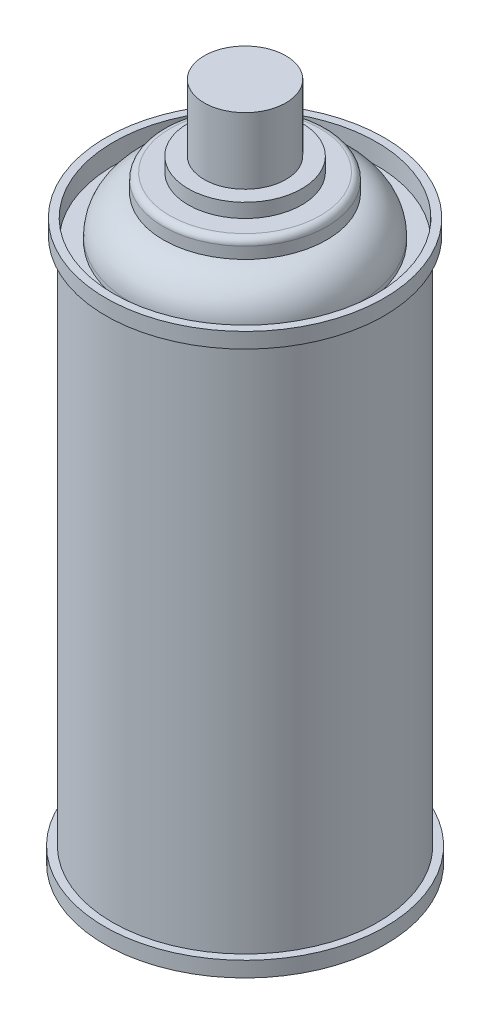
ISO-10303-21;
HEADER;
FILE_DESCRIPTION(('STEP AP214'),'2;1');
FILE_NAME('part.step','',(''),(''),'','','');
FILE_SCHEMA(('AUTOMOTIVE_DESIGN { 1 0 10303 214 1 1 1 1 }'));
ENDSEC;
DATA;
#1=APPLICATION_CONTEXT('core data for automotive mechanical design processes');
#2=APPLICATION_PROTOCOL_DEFINITION('international standard','automotive_design',2000,#1);
#3=PRODUCT_CONTEXT('',#1,'mechanical');
#4=PRODUCT('Part','Part','',(#3));
#5=PRODUCT_RELATED_PRODUCT_CATEGORY('part','',(#4));
#6=PRODUCT_DEFINITION_FORMATION('','',#4);
#7=PRODUCT_DEFINITION_CONTEXT('part definition',#1,'design');
#8=PRODUCT_DEFINITION('design','',#6,#7);
#9=PRODUCT_DEFINITION_SHAPE('','',#8);
#10=(LENGTH_UNIT() NAMED_UNIT(*) SI_UNIT(.MILLI.,.METRE.));
#11=(NAMED_UNIT(*) PLANE_ANGLE_UNIT() SI_UNIT($,.RADIAN.));
#12=(NAMED_UNIT(*) SI_UNIT($,.STERADIAN.) SOLID_ANGLE_UNIT());
#13=UNCERTAINTY_MEASURE_WITH_UNIT(LENGTH_MEASURE(1.E-05),#10,'distance_accuracy_value','');
#14=(GEOMETRIC_REPRESENTATION_CONTEXT(3) GLOBAL_UNCERTAINTY_ASSIGNED_CONTEXT((#13)) GLOBAL_UNIT_ASSIGNED_CONTEXT((#10,
#11,#12)) REPRESENTATION_CONTEXT('',''));
#15=CARTESIAN_POINT('',(0.,0.,0.));
#16=DIRECTION('',(0.,0.,1.));
#17=DIRECTION('',(1.,0.,0.));
#18=AXIS2_PLACEMENT_3D('',#15,#16,#17);
#19=CARTESIAN_POINT('',(0.,3.048,0.));
#20=DIRECTION('',(0.,-1.,0.));
#21=DIRECTION('',(0.,0.,-1.));
#22=AXIS2_PLACEMENT_3D('',#19,#20,#21);
#23=CYLINDRICAL_SURFACE('',#22,27.94);
#24=CARTESIAN_POINT('',(0.,3.048,0.));
#25=DIRECTION('',(0.,1.,0.));
#26=DIRECTION('',(0.,0.,1.));
#27=AXIS2_PLACEMENT_3D('',#24,#25,#26);
#28=CIRCLE('',#27,27.94);
#29=CARTESIAN_POINT('',(0.,3.048,-27.94));
#30=VERTEX_POINT('',#29);
#31=EDGE_CURVE('E46',#30,#30,#28,.T.);
#32=CARTESIAN_POINT('',(0.,0.,0.));
#33=DIRECTION('',(0.,1.,0.));
#34=DIRECTION('',(0.,0.,1.));
#35=AXIS2_PLACEMENT_3D('',#32,#33,#34);
#36=CIRCLE('',#35,27.94);
#37=CARTESIAN_POINT('',(0.,0.,-27.94));
#38=VERTEX_POINT('',#37);
#39=EDGE_CURVE('E49',#38,#38,#36,.T.);
#40=CARTESIAN_POINT('',(0.,3.048,-27.94));
#41=CARTESIAN_POINT('',(0.,3.01625,-27.94));
#42=CARTESIAN_POINT('',(0.,2.9845,-27.94));
#43=CARTESIAN_POINT('',(0.,2.921,-27.94));
#44=CARTESIAN_POINT('',(0.,2.88925,-27.94));
#45=CARTESIAN_POINT('',(0.,2.82575,-27.94));
#46=CARTESIAN_POINT('',(0.,2.794,-27.94));
#47=CARTESIAN_POINT('',(0.,2.7305,-27.94));
#48=CARTESIAN_POINT('',(0.,2.69875,-27.94));
#49=CARTESIAN_POINT('',(0.,2.63525,-27.94));
#50=CARTESIAN_POINT('',(0.,2.6035,-27.94));
#51=CARTESIAN_POINT('',(0.,2.54,-27.94));
#52=CARTESIAN_POINT('',(0.,2.50825,-27.94));
#53=CARTESIAN_POINT('',(0.,2.44475,-27.94));
#54=CARTESIAN_POINT('',(0.,2.413,-27.94));
#55=CARTESIAN_POINT('',(0.,2.3495,-27.94));
#56=CARTESIAN_POINT('',(0.,2.31775,-27.94));
#57=CARTESIAN_POINT('',(0.,2.25425,-27.94));
#58=CARTESIAN_POINT('',(0.,2.2225,-27.94));
#59=CARTESIAN_POINT('',(0.,2.159,-27.94));
#60=CARTESIAN_POINT('',(0.,2.12725,-27.94));
#61=CARTESIAN_POINT('',(0.,2.06375,-27.94));
#62=CARTESIAN_POINT('',(0.,2.032,-27.94));
#63=CARTESIAN_POINT('',(0.,1.9685,-27.94));
#64=CARTESIAN_POINT('',(0.,1.93675,-27.94));
#65=CARTESIAN_POINT('',(0.,1.87325,-27.94));
#66=CARTESIAN_POINT('',(0.,1.8415,-27.94));
#67=CARTESIAN_POINT('',(0.,1.778,-27.94));
#68=CARTESIAN_POINT('',(0.,1.74625,-27.94));
#69=CARTESIAN_POINT('',(0.,1.68275,-27.94));
#70=CARTESIAN_POINT('',(0.,1.651,-27.94));
#71=CARTESIAN_POINT('',(0.,1.5875,-27.94));
#72=CARTESIAN_POINT('',(0.,1.55575,-27.94));
#73=CARTESIAN_POINT('',(0.,1.49225,-27.94));
#74=CARTESIAN_POINT('',(0.,1.4605,-27.94));
#75=CARTESIAN_POINT('',(0.,1.397,-27.94));
#76=CARTESIAN_POINT('',(0.,1.36525,-27.94));
#77=CARTESIAN_POINT('',(0.,1.30175,-27.94));
#78=CARTESIAN_POINT('',(0.,1.27,-27.94));
#79=CARTESIAN_POINT('',(0.,1.2065,-27.94));
#80=CARTESIAN_POINT('',(0.,1.17475,-27.94));
#81=CARTESIAN_POINT('',(0.,1.11125,-27.94));
#82=CARTESIAN_POINT('',(0.,1.0795,-27.94));
#83=CARTESIAN_POINT('',(0.,1.016,-27.94));
#84=CARTESIAN_POINT('',(0.,0.98425,-27.94));
#85=CARTESIAN_POINT('',(0.,0.92075,-27.94));
#86=CARTESIAN_POINT('',(0.,0.889,-27.94));
#87=CARTESIAN_POINT('',(0.,0.8255,-27.94));
#88=CARTESIAN_POINT('',(0.,0.79375,-27.94));
#89=CARTESIAN_POINT('',(0.,0.73025,-27.94));
#90=CARTESIAN_POINT('',(0.,0.6985,-27.94));
#91=CARTESIAN_POINT('',(0.,0.635,-27.94));
#92=CARTESIAN_POINT('',(0.,0.60325,-27.94));
#93=CARTESIAN_POINT('',(0.,0.53975,-27.94));
#94=CARTESIAN_POINT('',(0.,0.508,-27.94));
#95=CARTESIAN_POINT('',(0.,0.4445,-27.94));
#96=CARTESIAN_POINT('',(0.,0.41275,-27.94));
#97=CARTESIAN_POINT('',(0.,0.34925,-27.94));
#98=CARTESIAN_POINT('',(0.,0.3175,-27.94));
#99=CARTESIAN_POINT('',(0.,0.254,-27.94));
#100=CARTESIAN_POINT('',(0.,0.22225,-27.94));
#101=CARTESIAN_POINT('',(0.,0.15875,-27.94));
#102=CARTESIAN_POINT('',(0.,0.127,-27.94));
#103=CARTESIAN_POINT('',(0.,0.0634999999999999,-27.94));
#104=CARTESIAN_POINT('',(0.,0.03175,-27.94));
#105=CARTESIAN_POINT('',(0.,0.,-27.94));
#106=B_SPLINE_CURVE_WITH_KNOTS('',3,(#40,#41,#42,#43,#44,#45,#46,#47,#48,#49,#50,#51,#52,#53,
#54,#55,#56,#57,#58,#59,#60,#61,#62,#63,#64,#65,#66,#67,#68,#69,#70,#71,#72,#73,#74,#75,#76,#77,
#78,#79,#80,#81,#82,#83,#84,#85,#86,#87,#88,#89,#90,#91,#92,#93,#94,#95,#96,#97,#98,#99,#100,
#101,#102,#103,#104,#105),.UNSPECIFIED.,.F.,.F.,(4,2,2,2,2,2,2,2,2,2,2,2,2,2,2,2,2,2,2,2,2,2,2,
2,2,2,2,2,2,2,2,2,4),(0.,0.0952499999999998,0.1905,0.28575,0.381,0.47625,0.5715,0.66675,0.762,
0.85725,0.9525,1.04775,1.143,1.23825,1.3335,1.42875,1.524,1.61925,1.7145,1.80975,1.905,2.00025,
2.0955,2.19075,2.286,2.38125,2.4765,2.57175,2.667,2.76225,2.8575,2.95275,3.048),.UNSPECIFIED.);
#107=EDGE_CURVE('BSEAM31',#30,#38,#106,.T.);
#108=ORIENTED_EDGE('',*,*,#31,.F.);
#109=ORIENTED_EDGE('',*,*,#39,.T.);
#110=ORIENTED_EDGE('',*,*,#107,.T.);
#111=ORIENTED_EDGE('',*,*,#107,.F.);
#112=EDGE_LOOP('',(#108,#110,#109,#111));
#113=FACE_BOUND('',#112,.T.);
#114=ADVANCED_FACE('F31',(#113),#23,.T.);
#115=CARTESIAN_POINT('',(0.,3.048,0.));
#116=DIRECTION('',(0.,1.,0.));
#117=DIRECTION('',(0.,0.,1.));
#118=AXIS2_PLACEMENT_3D('',#115,#116,#117);
#119=PLANE('',#118);
#120=CARTESIAN_POINT('',(0.,3.048,0.));
#121=DIRECTION('',(0.,1.,0.));
#122=DIRECTION('',(0.,0.,1.));
#123=AXIS2_PLACEMENT_3D('',#120,#121,#122);
#124=CIRCLE('',#123,26.416);
#125=CARTESIAN_POINT('',(0.,3.048,26.416));
#126=VERTEX_POINT('',#125);
#127=EDGE_CURVE('E55',#126,#126,#124,.T.);
#128=ORIENTED_EDGE('',*,*,#127,.F.);
#129=EDGE_LOOP('',(#128));
#130=FACE_BOUND('',#129,.T.);
#131=ORIENTED_EDGE('',*,*,#31,.T.);
#132=EDGE_LOOP('',(#131));
#133=FACE_BOUND('',#132,.T.);
#134=ADVANCED_FACE('F121',(#130,#133),#119,.T.);
#135=CARTESIAN_POINT('',(0.,0.,0.));
#136=DIRECTION('',(0.,1.,0.));
#137=DIRECTION('',(0.,0.,1.));
#138=AXIS2_PLACEMENT_3D('',#135,#136,#137);
#139=PLANE('',#138);
#140=ORIENTED_EDGE('',*,*,#39,.F.);
#141=EDGE_LOOP('',(#140));
#142=FACE_BOUND('',#141,.T.);
#143=ADVANCED_FACE('F127',(#142),#139,.F.);
#144=CARTESIAN_POINT('',(0.,108.204,0.));
#145=DIRECTION('',(0.,-1.,0.));
#146=DIRECTION('',(0.,0.,-1.));
#147=AXIS2_PLACEMENT_3D('',#144,#145,#146);
#148=CYLINDRICAL_SURFACE('',#147,26.416);
#149=CARTESIAN_POINT('',(0.,108.204,0.));
#150=DIRECTION('',(0.,1.,0.));
#151=DIRECTION('',(0.,0.,1.));
#152=AXIS2_PLACEMENT_3D('',#149,#150,#151);
#153=CIRCLE('',#152,26.416);
#154=CARTESIAN_POINT('',(0.,108.204,26.416));
#155=VERTEX_POINT('',#154);
#156=EDGE_CURVE('E52',#155,#155,#153,.T.);
#157=ORIENTED_EDGE('',*,*,#156,.F.);
#158=EDGE_LOOP('',(#157));
#159=FACE_BOUND('',#158,.T.);
#160=ORIENTED_EDGE('',*,*,#127,.T.);
#161=EDGE_LOOP('',(#160));
#162=FACE_BOUND('',#161,.T.);
#163=ADVANCED_FACE('F174',(#159,#162),#148,.T.);
#164=CARTESIAN_POINT('',(0.,111.252,0.));
#165=DIRECTION('',(0.,-1.,0.));
#166=DIRECTION('',(0.,0.,-1.));
#167=AXIS2_PLACEMENT_3D('',#164,#165,#166);
#168=CYLINDRICAL_SURFACE('',#167,27.686);
#169=CARTESIAN_POINT('',(0.,111.252,0.));
#170=DIRECTION('',(0.,1.,0.));
#171=DIRECTION('',(0.,0.,1.));
#172=AXIS2_PLACEMENT_3D('',#169,#170,#171);
#173=CIRCLE('',#172,27.686);
#174=CARTESIAN_POINT('',(0.,111.252,-27.686));
#175=VERTEX_POINT('',#174);
#176=EDGE_CURVE('E58',#175,#175,#173,.T.);
#177=CARTESIAN_POINT('',(0.,108.204,0.));
#178=DIRECTION('',(0.,1.,0.));
#179=DIRECTION('',(0.,0.,1.));
#180=AXIS2_PLACEMENT_3D('',#177,#178,#179);
#181=CIRCLE('',#180,27.686);
#182=CARTESIAN_POINT('',(0.,108.204,-27.686));
#183=VERTEX_POINT('',#182);
#184=EDGE_CURVE('E61',#183,#183,#181,.T.);
#185=CARTESIAN_POINT('',(0.,111.252,-27.686));
#186=CARTESIAN_POINT('',(0.,111.22025,-27.686));
#187=CARTESIAN_POINT('',(0.,111.1885,-27.686));
#188=CARTESIAN_POINT('',(0.,111.125,-27.686));
#189=CARTESIAN_POINT('',(0.,111.09325,-27.686));
#190=CARTESIAN_POINT('',(0.,111.02975,-27.686));
#191=CARTESIAN_POINT('',(0.,110.998,-27.686));
#192=CARTESIAN_POINT('',(0.,110.9345,-27.686));
#193=CARTESIAN_POINT('',(0.,110.90275,-27.686));
#194=CARTESIAN_POINT('',(0.,110.83925,-27.686));
#195=CARTESIAN_POINT('',(0.,110.8075,-27.686));
#196=CARTESIAN_POINT('',(0.,110.744,-27.686));
#197=CARTESIAN_POINT('',(0.,110.71225,-27.686));
#198=CARTESIAN_POINT('',(0.,110.64875,-27.686));
#199=CARTESIAN_POINT('',(0.,110.617,-27.686));
#200=CARTESIAN_POINT('',(0.,110.5535,-27.686));
#201=CARTESIAN_POINT('',(0.,110.52175,-27.686));
#202=CARTESIAN_POINT('',(0.,110.45825,-27.686));
#203=CARTESIAN_POINT('',(0.,110.4265,-27.686));
#204=CARTESIAN_POINT('',(0.,110.363,-27.686));
#205=CARTESIAN_POINT('',(0.,110.33125,-27.686));
#206=CARTESIAN_POINT('',(0.,110.26775,-27.686));
#207=CARTESIAN_POINT('',(0.,110.236,-27.686));
#208=CARTESIAN_POINT('',(0.,110.1725,-27.686));
#209=CARTESIAN_POINT('',(0.,110.14075,-27.686));
#210=CARTESIAN_POINT('',(0.,110.07725,-27.686));
#211=CARTESIAN_POINT('',(0.,110.0455,-27.686));
#212=CARTESIAN_POINT('',(0.,109.982,-27.686));
#213=CARTESIAN_POINT('',(0.,109.95025,-27.686));
#214=CARTESIAN_POINT('',(0.,109.88675,-27.686));
#215=CARTESIAN_POINT('',(0.,109.855,-27.686));
#216=CARTESIAN_POINT('',(0.,109.7915,-27.686));
#217=CARTESIAN_POINT('',(0.,109.75975,-27.686));
#218=CARTESIAN_POINT('',(0.,109.69625,-27.686));
#219=CARTESIAN_POINT('',(0.,109.6645,-27.686));
#220=CARTESIAN_POINT('',(0.,109.601,-27.686));
#221=CARTESIAN_POINT('',(0.,109.56925,-27.686));
#222=CARTESIAN_POINT('',(0.,109.50575,-27.686));
#223=CARTESIAN_POINT('',(0.,109.474,-27.686));
#224=CARTESIAN_POINT('',(0.,109.4105,-27.686));
#225=CARTESIAN_POINT('',(0.,109.37875,-27.686));
#226=CARTESIAN_POINT('',(0.,109.31525,-27.686));
#227=CARTESIAN_POINT('',(0.,109.2835,-27.686));
#228=CARTESIAN_POINT('',(0.,109.22,-27.686));
#229=CARTESIAN_POINT('',(0.,109.18825,-27.686));
#230=CARTESIAN_POINT('',(0.,109.12475,-27.686));
#231=CARTESIAN_POINT('',(0.,109.093,-27.686));
#232=CARTESIAN_POINT('',(0.,109.0295,-27.686));
#233=CARTESIAN_POINT('',(0.,108.99775,-27.686));
#234=CARTESIAN_POINT('',(0.,108.93425,-27.686));
#235=CARTESIAN_POINT('',(0.,108.9025,-27.686));
#236=CARTESIAN_POINT('',(0.,108.839,-27.686));
#237=CARTESIAN_POINT('',(0.,108.80725,-27.686));
#238=CARTESIAN_POINT('',(0.,108.74375,-27.686));
#239=CARTESIAN_POINT('',(0.,108.712,-27.686));
#240=CARTESIAN_POINT('',(0.,108.6485,-27.686));
#241=CARTESIAN_POINT('',(0.,108.61675,-27.686));
#242=CARTESIAN_POINT('',(0.,108.55325,-27.686));
#243=CARTESIAN_POINT('',(0.,108.5215,-27.686));
#244=CARTESIAN_POINT('',(0.,108.458,-27.686));
#245=CARTESIAN_POINT('',(0.,108.42625,-27.686));
#246=CARTESIAN_POINT('',(0.,108.36275,-27.686));
#247=CARTESIAN_POINT('',(0.,108.331,-27.686));
#248=CARTESIAN_POINT('',(0.,108.2675,-27.686));
#249=CARTESIAN_POINT('',(0.,108.23575,-27.686));
#250=CARTESIAN_POINT('',(0.,108.204,-27.686));
#251=B_SPLINE_CURVE_WITH_KNOTS('',3,(#185,#186,#187,#188,#189,#190,#191,#192,#193,#194,#195,
#196,#197,#198,#199,#200,#201,#202,#203,#204,#205,#206,#207,#208,#209,#210,#211,#212,#213,#214,
#215,#216,#217,#218,#219,#220,#221,#222,#223,#224,#225,#226,#227,#228,#229,#230,#231,#232,#233,
#234,#235,#236,#237,#238,#239,#240,#241,#242,#243,#244,#245,#246,#247,#248,#249,#250),
.UNSPECIFIED.,.F.,.F.,(4,2,2,2,2,2,2,2,2,2,2,2,2,2,2,2,2,2,2,2,2,2,2,2,2,2,2,2,2,2,2,2,4),(0.,
0.0952499999999912,0.190499999999996,0.285749999999987,0.380999999999992,0.476249999999998,
0.571499999999989,0.666749999999994,0.761999999999985,0.85724999999999,0.952499999999995,
1.04774999999999,1.14299999999999,1.23825,1.33349999999999,1.42874999999999,1.52399999999998,
1.61924999999999,1.71449999999999,1.80974999999999,1.90499999999999,2.00024999999999,
2.09549999999999,2.19074999999999,2.28599999999998,2.38124999999999,2.47649999999999,
2.57174999999998,2.66699999999999,2.76224999999999,2.85749999999998,2.95274999999999,
3.04799999999998),.UNSPECIFIED.);
#252=EDGE_CURVE('BSEAM168',#175,#183,#251,.T.);
#253=ORIENTED_EDGE('',*,*,#176,.F.);
#254=ORIENTED_EDGE('',*,*,#184,.T.);
#255=ORIENTED_EDGE('',*,*,#252,.T.);
#256=ORIENTED_EDGE('',*,*,#252,.F.);
#257=EDGE_LOOP('',(#253,#255,#254,#256));
#258=FACE_BOUND('',#257,.T.);
#259=ADVANCED_FACE('F168',(#258),#168,.T.);
#260=CARTESIAN_POINT('',(0.,111.252,0.));
#261=DIRECTION('',(0.,1.,0.));
#262=DIRECTION('',(0.,0.,1.));
#263=AXIS2_PLACEMENT_3D('',#260,#261,#262);
#264=PLANE('',#263);
#265=CARTESIAN_POINT('',(0.,111.252,0.));
#266=DIRECTION('',(0.,1.,0.));
#267=DIRECTION('',(0.,0.,1.));
#268=AXIS2_PLACEMENT_3D('',#265,#266,#267);
#269=CIRCLE('',#268,26.162);
#270=CARTESIAN_POINT('',(0.,111.252,26.162));
#271=VERTEX_POINT('',#270);
#272=EDGE_CURVE('E67',#271,#271,#269,.T.);
#273=ORIENTED_EDGE('',*,*,#272,.F.);
#274=EDGE_LOOP('',(#273));
#275=FACE_BOUND('',#274,.T.);
#276=ORIENTED_EDGE('',*,*,#176,.T.);
#277=EDGE_LOOP('',(#276));
#278=FACE_BOUND('',#277,.T.);
#279=ADVANCED_FACE('F165',(#275,#278),#264,.T.);
#280=CARTESIAN_POINT('',(0.,108.204,0.));
#281=DIRECTION('',(0.,1.,0.));
#282=DIRECTION('',(0.,0.,1.));
#283=AXIS2_PLACEMENT_3D('',#280,#281,#282);
#284=PLANE('',#283);
#285=ORIENTED_EDGE('',*,*,#156,.T.);
#286=EDGE_LOOP('',(#285));
#287=FACE_BOUND('',#286,.T.);
#288=ORIENTED_EDGE('',*,*,#184,.F.);
#289=EDGE_LOOP('',(#288));
#290=FACE_BOUND('',#289,.T.);
#291=ADVANCED_FACE('F161',(#287,#290),#284,.F.);
#292=CARTESIAN_POINT('',(0.,107.188,0.));
#293=DIRECTION('',(0.,1.,0.));
#294=DIRECTION('',(0.,0.,1.));
#295=AXIS2_PLACEMENT_3D('',#292,#293,#294);
#296=CYLINDRICAL_SURFACE('',#295,26.162);
#297=CARTESIAN_POINT('',(0.,107.188,0.));
#298=DIRECTION('',(0.,1.,0.));
#299=DIRECTION('',(0.,0.,1.));
#300=AXIS2_PLACEMENT_3D('',#297,#298,#299);
#301=CIRCLE('',#300,26.162);
#302=CARTESIAN_POINT('',(0.,107.188,26.162));
#303=VERTEX_POINT('',#302);
#304=EDGE_CURVE('E64',#303,#303,#301,.T.);
#305=ORIENTED_EDGE('',*,*,#304,.F.);
#306=EDGE_LOOP('',(#305));
#307=FACE_BOUND('',#306,.T.);
#308=ORIENTED_EDGE('',*,*,#272,.T.);
#309=EDGE_LOOP('',(#308));
#310=FACE_BOUND('',#309,.T.);
#311=ADVANCED_FACE('F155',(#307,#310),#296,.F.);
#312=CARTESIAN_POINT('',(0.,107.188,0.));
#313=DIRECTION('',(0.,1.,0.));
#314=DIRECTION('',(0.,0.,1.));
#315=AXIS2_PLACEMENT_3D('',#312,#313,#314);
#316=PLANE('',#315);
#317=CARTESIAN_POINT('',(0.,107.188,0.));
#318=DIRECTION('',(0.,1.,0.));
#319=DIRECTION('',(0.,0.,1.));
#320=AXIS2_PLACEMENT_3D('',#317,#318,#319);
#321=CIRCLE('',#320,22.733);
#322=CARTESIAN_POINT('',(0.,107.188,22.733));
#323=VERTEX_POINT('',#322);
#324=EDGE_CURVE('E70',#323,#323,#321,.T.);
#325=ORIENTED_EDGE('',*,*,#324,.F.);
#326=EDGE_LOOP('',(#325));
#327=FACE_BOUND('',#326,.T.);
#328=ORIENTED_EDGE('',*,*,#304,.T.);
#329=EDGE_LOOP('',(#328));
#330=FACE_BOUND('',#329,.T.);
#331=ADVANCED_FACE('F149',(#327,#330),#316,.T.);
#332=CARTESIAN_POINT('',(0.,115.57,0.));
#333=DIRECTION('',(0.,-1.,0.));
#334=DIRECTION('',(0.,0.,-1.));
#335=AXIS2_PLACEMENT_3D('',#332,#333,#334);
#336=CYLINDRICAL_SURFACE('',#335,22.733);
#337=CARTESIAN_POINT('',(0.,108.036212705418,0.));
#338=DIRECTION('',(0.,1.,0.));
#339=DIRECTION('',(0.,0.,1.));
#340=AXIS2_PLACEMENT_3D('',#337,#338,#339);
#341=CIRCLE('',#340,22.733);
#342=CARTESIAN_POINT('',(0.,108.036212705418,22.733));
#343=VERTEX_POINT('',#342);
#344=EDGE_CURVE('E42',#343,#343,#341,.F.);
#345=ORIENTED_EDGE('',*,*,#344,.T.);
#346=EDGE_LOOP('',(#345));
#347=FACE_BOUND('',#346,.T.);
#348=ORIENTED_EDGE('',*,*,#324,.T.);
#349=EDGE_LOOP('',(#348));
#350=FACE_BOUND('',#349,.T.);
#351=ADVANCED_FACE('F118',(#347,#350),#336,.T.);
#352=CARTESIAN_POINT('',(0.,119.126,0.));
#353=DIRECTION('',(0.,-1.,0.));
#354=DIRECTION('',(0.,0.,-1.));
#355=AXIS2_PLACEMENT_3D('',#352,#353,#354);
#356=CYLINDRICAL_SURFACE('',#355,16.256);
#357=CARTESIAN_POINT('',(0.,117.856,0.));
#358=DIRECTION('',(0.,1.,0.));
#359=DIRECTION('',(0.,0.,1.));
#360=AXIS2_PLACEMENT_3D('',#357,#358,#359);
#361=CIRCLE('',#360,16.256);
#362=CARTESIAN_POINT('',(0.,117.856,16.256));
#363=VERTEX_POINT('',#362);
#364=EDGE_CURVE('E10',#363,#363,#361,.F.);
#365=ORIENTED_EDGE('',*,*,#364,.T.);
#366=EDGE_LOOP('',(#365));
#367=FACE_BOUND('',#366,.T.);
#368=CARTESIAN_POINT('',(0.,115.57,0.));
#369=DIRECTION('',(0.,1.,0.));
#370=DIRECTION('',(0.,0.,1.));
#371=AXIS2_PLACEMENT_3D('',#368,#369,#370);
#372=CIRCLE('',#371,16.256);
#373=CARTESIAN_POINT('',(0.,115.57,16.256));
#374=VERTEX_POINT('',#373);
#375=EDGE_CURVE('E75',#374,#374,#372,.T.);
#376=ORIENTED_EDGE('',*,*,#375,.T.);
#377=EDGE_LOOP('',(#376));
#378=FACE_BOUND('',#377,.T.);
#379=ADVANCED_FACE('F113',(#367,#378),#356,.T.);
#380=CARTESIAN_POINT('',(0.,119.126,0.));
#381=DIRECTION('',(0.,1.,0.));
#382=DIRECTION('',(0.,0.,1.));
#383=AXIS2_PLACEMENT_3D('',#380,#381,#382);
#384=PLANE('',#383);
#385=CARTESIAN_POINT('',(0.,119.126,0.));
#386=DIRECTION('',(0.,1.,0.));
#387=DIRECTION('',(0.,0.,1.));
#388=AXIS2_PLACEMENT_3D('',#385,#386,#387);
#389=CIRCLE('',#388,14.986);
#390=CARTESIAN_POINT('',(0.,119.126,14.986));
#391=VERTEX_POINT('',#390);
#392=EDGE_CURVE('E38',#391,#391,#389,.T.);
#393=ORIENTED_EDGE('',*,*,#392,.T.);
#394=EDGE_LOOP('',(#393));
#395=FACE_BOUND('',#394,.T.);
#396=CARTESIAN_POINT('',(0.,119.126,0.));
#397=DIRECTION('',(0.,1.,0.));
#398=DIRECTION('',(0.,0.,1.));
#399=AXIS2_PLACEMENT_3D('',#396,#397,#398);
#400=CIRCLE('',#399,11.303);
#401=CARTESIAN_POINT('',(0.,119.126,11.303));
#402=VERTEX_POINT('',#401);
#403=EDGE_CURVE('E79',#402,#402,#400,.T.);
#404=ORIENTED_EDGE('',*,*,#403,.F.);
#405=EDGE_LOOP('',(#404));
#406=FACE_BOUND('',#405,.T.);
#407=ADVANCED_FACE('F108',(#395,#406),#384,.T.);
#408=CARTESIAN_POINT('',(0.,121.92,0.));
#409=DIRECTION('',(0.,-1.,0.));
#410=DIRECTION('',(0.,0.,-1.));
#411=AXIS2_PLACEMENT_3D('',#408,#409,#410);
#412=CYLINDRICAL_SURFACE('',#411,11.303);
#413=CARTESIAN_POINT('',(0.,121.92,0.));
#414=DIRECTION('',(0.,1.,0.));
#415=DIRECTION('',(0.,0.,1.));
#416=AXIS2_PLACEMENT_3D('',#413,#414,#415);
#417=CIRCLE('',#416,11.303);
#418=CARTESIAN_POINT('',(0.,121.92,11.303));
#419=VERTEX_POINT('',#418);
#420=EDGE_CURVE('E78',#419,#419,#417,.T.);
#421=ORIENTED_EDGE('',*,*,#420,.F.);
#422=EDGE_LOOP('',(#421));
#423=FACE_BOUND('',#422,.T.);
#424=ORIENTED_EDGE('',*,*,#403,.T.);
#425=EDGE_LOOP('',(#424));
#426=FACE_BOUND('',#425,.T.);
#427=ADVANCED_FACE('F102',(#423,#426),#412,.T.);
#428=CARTESIAN_POINT('',(0.,121.92,0.));
#429=DIRECTION('',(0.,1.,0.));
#430=DIRECTION('',(0.,0.,1.));
#431=AXIS2_PLACEMENT_3D('',#428,#429,#430);
#432=PLANE('',#431);
#433=CARTESIAN_POINT('',(0.,121.92,0.));
#434=DIRECTION('',(0.,1.,0.));
#435=DIRECTION('',(0.,0.,1.));
#436=AXIS2_PLACEMENT_3D('',#433,#434,#435);
#437=CIRCLE('',#436,8.128);
#438=CARTESIAN_POINT('',(0.,121.92,-8.128));
#439=VERTEX_POINT('',#438);
#440=EDGE_CURVE('E85',#439,#439,#437,.T.);
#441=ORIENTED_EDGE('',*,*,#440,.F.);
#442=EDGE_LOOP('',(#441));
#443=FACE_BOUND('',#442,.T.);
#444=ORIENTED_EDGE('',*,*,#420,.T.);
#445=EDGE_LOOP('',(#444));
#446=FACE_BOUND('',#445,.T.);
#447=ADVANCED_FACE('F96',(#443,#446),#432,.T.);
#448=CARTESIAN_POINT('',(0.,135.128,0.));
#449=DIRECTION('',(0.,-1.,0.));
#450=DIRECTION('',(0.,0.,-1.));
#451=AXIS2_PLACEMENT_3D('',#448,#449,#450);
#452=CYLINDRICAL_SURFACE('',#451,8.128);
#453=CARTESIAN_POINT('',(0.,135.128,0.));
#454=DIRECTION('',(0.,1.,0.));
#455=DIRECTION('',(0.,0.,1.));
#456=AXIS2_PLACEMENT_3D('',#453,#454,#455);
#457=CIRCLE('',#456,8.128);
#458=CARTESIAN_POINT('',(0.,135.128,-8.128));
#459=VERTEX_POINT('',#458);
#460=EDGE_CURVE('E82',#459,#459,#457,.T.);
#461=CARTESIAN_POINT('',(0.,135.128,-8.128));
#462=CARTESIAN_POINT('',(0.,134.990416666667,-8.128));
#463=CARTESIAN_POINT('',(0.,134.852833333333,-8.128));
#464=CARTESIAN_POINT('',(0.,134.577666666667,-8.128));
#465=CARTESIAN_POINT('',(0.,134.440083333333,-8.128));
#466=CARTESIAN_POINT('',(0.,134.164916666667,-8.128));
#467=CARTESIAN_POINT('',(0.,134.027333333333,-8.128));
#468=CARTESIAN_POINT('',(0.,133.752166666667,-8.128));
#469=CARTESIAN_POINT('',(0.,133.614583333333,-8.128));
#470=CARTESIAN_POINT('',(0.,133.339416666667,-8.128));
#471=CARTESIAN_POINT('',(0.,133.201833333333,-8.128));
#472=CARTESIAN_POINT('',(0.,132.926666666667,-8.128));
#473=CARTESIAN_POINT('',(0.,132.789083333333,-8.128));
#474=CARTESIAN_POINT('',(0.,132.513916666667,-8.128));
#475=CARTESIAN_POINT('',(0.,132.376333333333,-8.128));
#476=CARTESIAN_POINT('',(0.,132.101166666667,-8.128));
#477=CARTESIAN_POINT('',(0.,131.963583333333,-8.128));
#478=CARTESIAN_POINT('',(0.,131.688416666667,-8.128));
#479=CARTESIAN_POINT('',(0.,131.550833333333,-8.128));
#480=CARTESIAN_POINT('',(0.,131.275666666667,-8.128));
#481=CARTESIAN_POINT('',(0.,131.138083333333,-8.128));
#482=CARTESIAN_POINT('',(0.,130.862916666667,-8.128));
#483=CARTESIAN_POINT('',(0.,130.725333333333,-8.128));
#484=CARTESIAN_POINT('',(0.,130.450166666667,-8.128));
#485=CARTESIAN_POINT('',(0.,130.312583333333,-8.128));
#486=CARTESIAN_POINT('',(0.,130.037416666667,-8.128));
#487=CARTESIAN_POINT('',(0.,129.899833333333,-8.128));
#488=CARTESIAN_POINT('',(0.,129.624666666667,-8.128));
#489=CARTESIAN_POINT('',(0.,129.487083333333,-8.128));
#490=CARTESIAN_POINT('',(0.,129.211916666667,-8.128));
#491=CARTESIAN_POINT('',(0.,129.074333333333,-8.128));
#492=CARTESIAN_POINT('',(0.,128.799166666667,-8.128));
#493=CARTESIAN_POINT('',(0.,128.661583333333,-8.128));
#494=CARTESIAN_POINT('',(0.,128.386416666667,-8.128));
#495=CARTESIAN_POINT('',(0.,128.248833333333,-8.128));
#496=CARTESIAN_POINT('',(0.,127.973666666667,-8.128));
#497=CARTESIAN_POINT('',(0.,127.836083333333,-8.128));
#498=CARTESIAN_POINT('',(0.,127.560916666667,-8.128));
#499=CARTESIAN_POINT('',(0.,127.423333333333,-8.128));
#500=CARTESIAN_POINT('',(0.,127.148166666667,-8.128));
#501=CARTESIAN_POINT('',(0.,127.010583333333,-8.128));
#502=CARTESIAN_POINT('',(0.,126.735416666667,-8.128));
#503=CARTESIAN_POINT('',(0.,126.597833333333,-8.128));
#504=CARTESIAN_POINT('',(0.,126.322666666667,-8.128));
#505=CARTESIAN_POINT('',(0.,126.185083333333,-8.128));
#506=CARTESIAN_POINT('',(0.,125.909916666667,-8.128));
#507=CARTESIAN_POINT('',(0.,125.772333333333,-8.128));
#508=CARTESIAN_POINT('',(0.,125.497166666667,-8.128));
#509=CARTESIAN_POINT('',(0.,125.359583333333,-8.128));
#510=CARTESIAN_POINT('',(0.,125.084416666667,-8.128));
#511=CARTESIAN_POINT('',(0.,124.946833333333,-8.128));
#512=CARTESIAN_POINT('',(0.,124.671666666667,-8.128));
#513=CARTESIAN_POINT('',(0.,124.534083333333,-8.128));
#514=CARTESIAN_POINT('',(0.,124.258916666667,-8.128));
#515=CARTESIAN_POINT('',(0.,124.121333333333,-8.128));
#516=CARTESIAN_POINT('',(0.,123.846166666667,-8.128));
#517=CARTESIAN_POINT('',(0.,123.708583333333,-8.128));
#518=CARTESIAN_POINT('',(0.,123.433416666667,-8.128));
#519=CARTESIAN_POINT('',(0.,123.295833333333,-8.128));
#520=CARTESIAN_POINT('',(0.,123.020666666667,-8.128));
#521=CARTESIAN_POINT('',(0.,122.883083333333,-8.128));
#522=CARTESIAN_POINT('',(0.,122.607916666667,-8.128));
#523=CARTESIAN_POINT('',(0.,122.470333333333,-8.128));
#524=CARTESIAN_POINT('',(0.,122.195166666667,-8.128));
#525=CARTESIAN_POINT('',(0.,122.057583333333,-8.128));
#526=CARTESIAN_POINT('',(0.,121.92,-8.128));
#527=B_SPLINE_CURVE_WITH_KNOTS('',3,(#461,#462,#463,#464,#465,#466,#467,#468,#469,#470,#471,
#472,#473,#474,#475,#476,#477,#478,#479,#480,#481,#482,#483,#484,#485,#486,#487,#488,#489,#490,
#491,#492,#493,#494,#495,#496,#497,#498,#499,#500,#501,#502,#503,#504,#505,#506,#507,#508,#509,
#510,#511,#512,#513,#514,#515,#516,#517,#518,#519,#520,#521,#522,#523,#524,#525,#526),
.UNSPECIFIED.,.F.,.F.,(4,2,2,2,2,2,2,2,2,2,2,2,2,2,2,2,2,2,2,2,2,2,2,2,2,2,2,2,2,2,2,2,4),(0.,
0.412750000000017,0.825500000000007,1.23825000000002,1.65100000000001,2.06375,2.47650000000002,
2.88925000000001,3.30200000000003,3.71475000000002,4.12750000000001,4.54025000000002,
4.95300000000001,5.36575,5.77850000000002,6.19125000000001,6.60400000000003,7.01675000000002,
7.42950000000001,7.84225000000002,8.25500000000001,8.66775,9.08050000000002,9.49325000000001,
9.90600000000003,10.31875,10.7315,11.14425,11.557,11.96975,12.3825,12.79525,13.208),.UNSPECIFIED.);
#528=EDGE_CURVE('BSEAM93',#459,#439,#527,.T.);
#529=ORIENTED_EDGE('',*,*,#460,.F.);
#530=ORIENTED_EDGE('',*,*,#440,.T.);
#531=ORIENTED_EDGE('',*,*,#528,.T.);
#532=ORIENTED_EDGE('',*,*,#528,.F.);
#533=EDGE_LOOP('',(#529,#531,#530,#532));
#534=FACE_BOUND('',#533,.T.);
#535=ADVANCED_FACE('F93',(#534),#452,.T.);
#536=CARTESIAN_POINT('',(0.,135.128,0.));
#537=DIRECTION('',(0.,1.,0.));
#538=DIRECTION('',(0.,0.,1.));
#539=AXIS2_PLACEMENT_3D('',#536,#537,#538);
#540=PLANE('',#539);
#541=ORIENTED_EDGE('',*,*,#460,.T.);
#542=EDGE_LOOP('',(#541));
#543=FACE_BOUND('',#542,.T.);
#544=ADVANCED_FACE('F91',(#543),#540,.T.);
#545=CARTESIAN_POINT('',(0.,108.036212705418,0.));
#546=DIRECTION('',(0.,1.,0.));
#547=DIRECTION('',(0.,0.,1.));
#548=AXIS2_PLACEMENT_3D('',#545,#546,#547);
#549=TOROIDAL_SURFACE('',#548,15.113,7.62);
#550=ORIENTED_EDGE('',*,*,#344,.F.);
#551=EDGE_LOOP('',(#550));
#552=FACE_BOUND('',#551,.T.);
#553=ORIENTED_EDGE('',*,*,#375,.F.);
#554=EDGE_LOOP('',(#553));
#555=FACE_BOUND('',#554,.T.);
#556=ADVANCED_FACE('F133',(#552,#555),#549,.T.);
#557=CARTESIAN_POINT('',(0.,117.856,0.));
#558=DIRECTION('',(0.,1.,0.));
#559=DIRECTION('',(0.,0.,1.));
#560=AXIS2_PLACEMENT_3D('',#557,#558,#559);
#561=TOROIDAL_SURFACE('',#560,14.986,1.27);
#562=ORIENTED_EDGE('',*,*,#364,.F.);
#563=EDGE_LOOP('',(#562));
#564=FACE_BOUND('',#563,.T.);
#565=ORIENTED_EDGE('',*,*,#392,.F.);
#566=EDGE_LOOP('',(#565));
#567=FACE_BOUND('',#566,.T.);
#568=ADVANCED_FACE('F33',(#564,#567),#561,.T.);
#569=CLOSED_SHELL('',(#114,#134,#143,#163,#259,#279,#291,#311,#331,#351,#379,#407,#427,#447,
#535,#544,#556,#568));
#570=MANIFOLD_SOLID_BREP('B2',#569);
#571=ADVANCED_BREP_SHAPE_REPRESENTATION('',(#18,#570),#14);
#572=SHAPE_DEFINITION_REPRESENTATION(#9,#571);
ENDSEC;
END-ISO-10303-21;
